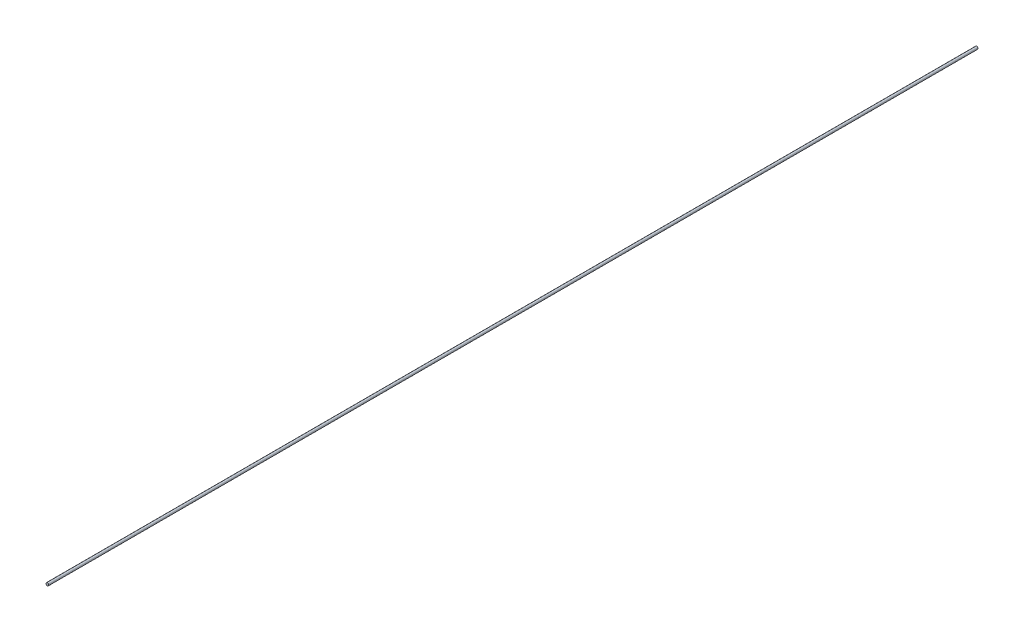
ISO-10303-21;
HEADER;
FILE_DESCRIPTION(('STEP AP214'),'2;1');
FILE_NAME('part.step','',(''),(''),'','','');
FILE_SCHEMA(('AUTOMOTIVE_DESIGN { 1 0 10303 214 1 1 1 1 }'));
ENDSEC;
DATA;
#1=APPLICATION_CONTEXT('core data for automotive mechanical design processes');
#2=APPLICATION_PROTOCOL_DEFINITION('international standard','automotive_design',2000,#1);
#3=PRODUCT_CONTEXT('',#1,'mechanical');
#4=PRODUCT('Part','Part','',(#3));
#5=PRODUCT_RELATED_PRODUCT_CATEGORY('part','',(#4));
#6=PRODUCT_DEFINITION_FORMATION('','',#4);
#7=PRODUCT_DEFINITION_CONTEXT('part definition',#1,'design');
#8=PRODUCT_DEFINITION('design','',#6,#7);
#9=PRODUCT_DEFINITION_SHAPE('','',#8);
#10=(LENGTH_UNIT() NAMED_UNIT(*) SI_UNIT(.MILLI.,.METRE.));
#11=(NAMED_UNIT(*) PLANE_ANGLE_UNIT() SI_UNIT($,.RADIAN.));
#12=(NAMED_UNIT(*) SI_UNIT($,.STERADIAN.) SOLID_ANGLE_UNIT());
#13=UNCERTAINTY_MEASURE_WITH_UNIT(LENGTH_MEASURE(1.E-05),#10,'distance_accuracy_value','');
#14=(GEOMETRIC_REPRESENTATION_CONTEXT(3) GLOBAL_UNCERTAINTY_ASSIGNED_CONTEXT((#13)) GLOBAL_UNIT_ASSIGNED_CONTEXT((#10,
#11,#12)) REPRESENTATION_CONTEXT('',''));
#15=CARTESIAN_POINT('',(0.,0.,0.));
#16=DIRECTION('',(0.,0.,1.));
#17=DIRECTION('',(1.,0.,0.));
#18=AXIS2_PLACEMENT_3D('',#15,#16,#17);
#19=CARTESIAN_POINT('',(0.,0.,700.));
#20=DIRECTION('',(0.,0.,-1.));
#21=DIRECTION('',(-1.,0.,0.));
#22=AXIS2_PLACEMENT_3D('',#19,#20,#21);
#23=CYLINDRICAL_SURFACE('',#22,1.);
#24=CARTESIAN_POINT('',(0.,0.,700.));
#25=DIRECTION('',(0.,0.,1.));
#26=DIRECTION('',(1.,0.,0.));
#27=AXIS2_PLACEMENT_3D('',#24,#25,#26);
#28=CIRCLE('',#27,1.);
#29=CARTESIAN_POINT('',(1.,0.,700.));
#30=VERTEX_POINT('',#29);
#31=EDGE_CURVE('E10',#30,#30,#28,.T.);
#32=ORIENTED_EDGE('',*,*,#31,.F.);
#33=EDGE_LOOP('',(#32));
#34=FACE_BOUND('',#33,.T.);
#35=CARTESIAN_POINT('',(0.,0.,0.));
#36=DIRECTION('',(0.,0.,1.));
#37=DIRECTION('',(1.,0.,0.));
#38=AXIS2_PLACEMENT_3D('',#35,#36,#37);
#39=CIRCLE('',#38,1.);
#40=CARTESIAN_POINT('',(1.,0.,0.));
#41=VERTEX_POINT('',#40);
#42=EDGE_CURVE('E40',#41,#41,#39,.T.);
#43=ORIENTED_EDGE('',*,*,#42,.T.);
#44=EDGE_LOOP('',(#43));
#45=FACE_BOUND('',#44,.T.);
#46=ADVANCED_FACE('F37',(#34,#45),#23,.T.);
#47=CARTESIAN_POINT('',(0.,0.,700.));
#48=DIRECTION('',(0.,0.,1.));
#49=DIRECTION('',(1.,0.,0.));
#50=AXIS2_PLACEMENT_3D('',#47,#48,#49);
#51=PLANE('',#50);
#52=ORIENTED_EDGE('',*,*,#31,.T.);
#53=EDGE_LOOP('',(#52));
#54=FACE_BOUND('',#53,.T.);
#55=ADVANCED_FACE('F52',(#54),#51,.T.);
#56=CARTESIAN_POINT('',(0.,0.,0.));
#57=DIRECTION('',(0.,0.,1.));
#58=DIRECTION('',(1.,0.,0.));
#59=AXIS2_PLACEMENT_3D('',#56,#57,#58);
#60=PLANE('',#59);
#61=ORIENTED_EDGE('',*,*,#42,.F.);
#62=EDGE_LOOP('',(#61));
#63=FACE_BOUND('',#62,.T.);
#64=ADVANCED_FACE('F50',(#63),#60,.F.);
#65=CLOSED_SHELL('',(#46,#55,#64));
#66=MANIFOLD_SOLID_BREP('B2',#65);
#67=ADVANCED_BREP_SHAPE_REPRESENTATION('',(#18,#66),#14);
#68=SHAPE_DEFINITION_REPRESENTATION(#9,#67);
ENDSEC;
END-ISO-10303-21;
